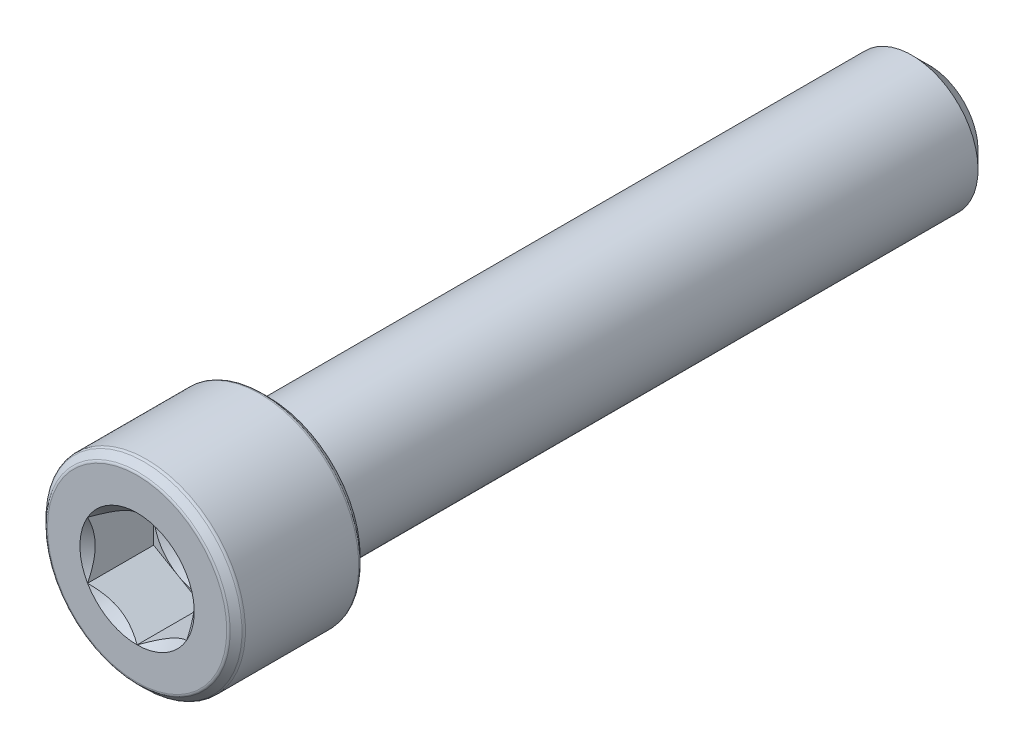
ISO-10303-21;
HEADER;
FILE_DESCRIPTION(('STEP AP214'),'2;1');
FILE_NAME('part.step','',(''),(''),'','','');
FILE_SCHEMA(('AUTOMOTIVE_DESIGN { 1 0 10303 214 1 1 1 1 }'));
ENDSEC;
DATA;
#1=APPLICATION_CONTEXT('core data for automotive mechanical design processes');
#2=APPLICATION_PROTOCOL_DEFINITION('international standard','automotive_design',2000,#1);
#3=PRODUCT_CONTEXT('',#1,'mechanical');
#4=PRODUCT('Part','Part','',(#3));
#5=PRODUCT_RELATED_PRODUCT_CATEGORY('part','',(#4));
#6=PRODUCT_DEFINITION_FORMATION('','',#4);
#7=PRODUCT_DEFINITION_CONTEXT('part definition',#1,'design');
#8=PRODUCT_DEFINITION('design','',#6,#7);
#9=PRODUCT_DEFINITION_SHAPE('','',#8);
#10=(LENGTH_UNIT() NAMED_UNIT(*) SI_UNIT(.MILLI.,.METRE.));
#11=(NAMED_UNIT(*) PLANE_ANGLE_UNIT() SI_UNIT($,.RADIAN.));
#12=(NAMED_UNIT(*) SI_UNIT($,.STERADIAN.) SOLID_ANGLE_UNIT());
#13=UNCERTAINTY_MEASURE_WITH_UNIT(LENGTH_MEASURE(1.E-05),#10,'distance_accuracy_value','');
#14=(GEOMETRIC_REPRESENTATION_CONTEXT(3) GLOBAL_UNCERTAINTY_ASSIGNED_CONTEXT((#13)) GLOBAL_UNIT_ASSIGNED_CONTEXT((#10,
#11,#12)) REPRESENTATION_CONTEXT('',''));
#15=CARTESIAN_POINT('',(0.,0.,0.));
#16=DIRECTION('',(0.,0.,1.));
#17=DIRECTION('',(1.,0.,0.));
#18=AXIS2_PLACEMENT_3D('',#15,#16,#17);
#19=CARTESIAN_POINT('',(0.,2.38125,15.875));
#20=DIRECTION('',(0.,0.,-1.));
#21=DIRECTION('',(0.,1.,0.));
#22=AXIS2_PLACEMENT_3D('',#19,#20,#21);
#23=PLANE('',#22);
#24=DIRECTION('',(-0.866025403784439,0.5,0.));
#25=VECTOR('',#24,1.);
#26=CARTESIAN_POINT('',(2.38125,1.3748153285078,15.875));
#27=LINE('',#26,#25);
#28=CARTESIAN_POINT('',(2.38125,1.3748153285078,15.875));
#29=VERTEX_POINT('',#28);
#30=CARTESIAN_POINT('',(1.190625,2.06222299276169,15.875));
#31=VERTEX_POINT('',#30);
#32=EDGE_CURVE('E276',#29,#31,#27,.T.);
#33=ORIENTED_EDGE('',*,*,#32,.T.);
#34=CARTESIAN_POINT('',(0.,0.,15.875));
#35=DIRECTION('',(0.,0.,1.));
#36=DIRECTION('',(1.,0.,0.));
#37=AXIS2_PLACEMENT_3D('',#34,#35,#36);
#38=CIRCLE('',#37,2.38125);
#39=CARTESIAN_POINT('',(2.38125,0.,15.875));
#40=VERTEX_POINT('',#39);
#41=EDGE_CURVE('E50',#40,#31,#38,.T.);
#42=ORIENTED_EDGE('',*,*,#41,.F.);
#43=DIRECTION('',(0.,1.,0.));
#44=VECTOR('',#43,1.);
#45=CARTESIAN_POINT('',(2.38125,-1.37481532850779,15.875));
#46=LINE('',#45,#44);
#47=EDGE_CURVE('E57',#40,#29,#46,.T.);
#48=ORIENTED_EDGE('',*,*,#47,.T.);
#49=EDGE_LOOP('',(#33,#42,#48));
#50=FACE_BOUND('',#49,.T.);
#51=ADVANCED_FACE('F34',(#50),#23,.F.);
#52=CARTESIAN_POINT('',(2.38125,-1.37481532850779,15.875));
#53=VERTEX_POINT('',#52);
#54=EDGE_CURVE('E181',#53,#40,#46,.T.);
#55=ORIENTED_EDGE('',*,*,#54,.T.);
#56=CARTESIAN_POINT('',(0.,0.,15.875));
#57=DIRECTION('',(0.,0.,-1.));
#58=DIRECTION('',(0.,1.,0.));
#59=AXIS2_PLACEMENT_3D('',#56,#57,#58);
#60=CIRCLE('',#59,2.38125);
#61=CARTESIAN_POINT('',(1.190625,-2.06222299276169,15.875));
#62=VERTEX_POINT('',#61);
#63=EDGE_CURVE('E11',#40,#62,#60,.T.);
#64=ORIENTED_EDGE('',*,*,#63,.T.);
#65=DIRECTION('',(0.866025403784439,0.5,0.));
#66=VECTOR('',#65,1.);
#67=CARTESIAN_POINT('',(0.,-2.74963065701559,15.875));
#68=LINE('',#67,#66);
#69=EDGE_CURVE('E177',#62,#53,#68,.T.);
#70=ORIENTED_EDGE('',*,*,#69,.T.);
#71=EDGE_LOOP('',(#55,#64,#70));
#72=FACE_BOUND('',#71,.T.);
#73=ADVANCED_FACE('F120',(#72),#23,.F.);
#74=CARTESIAN_POINT('',(0.,-2.74963065701559,15.875));
#75=VERTEX_POINT('',#74);
#76=EDGE_CURVE('E178',#75,#62,#68,.T.);
#77=ORIENTED_EDGE('',*,*,#76,.T.);
#78=CARTESIAN_POINT('',(-1.190625,-2.06222299276169,15.875));
#79=VERTEX_POINT('',#78);
#80=EDGE_CURVE('E43',#62,#79,#60,.T.);
#81=ORIENTED_EDGE('',*,*,#80,.T.);
#82=DIRECTION('',(0.866025403784439,-0.5,0.));
#83=VECTOR('',#82,1.);
#84=CARTESIAN_POINT('',(-2.38125,-1.37481532850779,15.875));
#85=LINE('',#84,#83);
#86=EDGE_CURVE('E167',#79,#75,#85,.T.);
#87=ORIENTED_EDGE('',*,*,#86,.T.);
#88=EDGE_LOOP('',(#77,#81,#87));
#89=FACE_BOUND('',#88,.T.);
#90=ADVANCED_FACE('F126',(#89),#23,.F.);
#91=CARTESIAN_POINT('',(-2.38125,-1.37481532850779,15.875));
#92=VERTEX_POINT('',#91);
#93=EDGE_CURVE('E170',#92,#79,#85,.T.);
#94=ORIENTED_EDGE('',*,*,#93,.T.);
#95=CARTESIAN_POINT('',(-2.38125,0.,15.875));
#96=VERTEX_POINT('',#95);
#97=EDGE_CURVE('E235',#79,#96,#60,.T.);
#98=ORIENTED_EDGE('',*,*,#97,.T.);
#99=DIRECTION('',(0.,-1.,0.));
#100=VECTOR('',#99,1.);
#101=CARTESIAN_POINT('',(-2.38125,1.3748153285078,15.875));
#102=LINE('',#101,#100);
#103=EDGE_CURVE('E168',#96,#92,#102,.T.);
#104=ORIENTED_EDGE('',*,*,#103,.T.);
#105=EDGE_LOOP('',(#94,#98,#104));
#106=FACE_BOUND('',#105,.T.);
#107=ADVANCED_FACE('F147',(#106),#23,.F.);
#108=CARTESIAN_POINT('',(-2.38125,1.3748153285078,15.875));
#109=VERTEX_POINT('',#108);
#110=EDGE_CURVE('E159',#109,#96,#102,.T.);
#111=ORIENTED_EDGE('',*,*,#110,.T.);
#112=CARTESIAN_POINT('',(-1.190625,2.0622229927617,15.875));
#113=VERTEX_POINT('',#112);
#114=EDGE_CURVE('E160',#96,#113,#60,.T.);
#115=ORIENTED_EDGE('',*,*,#114,.T.);
#116=DIRECTION('',(-0.866025403784439,-0.5,0.));
#117=VECTOR('',#116,1.);
#118=CARTESIAN_POINT('',(0.,2.74963065701559,15.875));
#119=LINE('',#118,#117);
#120=EDGE_CURVE('E162',#113,#109,#119,.T.);
#121=ORIENTED_EDGE('',*,*,#120,.T.);
#122=EDGE_LOOP('',(#111,#115,#121));
#123=FACE_BOUND('',#122,.T.);
#124=ADVANCED_FACE('F134',(#123),#23,.F.);
#125=CARTESIAN_POINT('',(0.,4.31245577682193,19.05));
#126=DIRECTION('',(0.,0.,-1.));
#127=DIRECTION('',(0.,1.,0.));
#128=AXIS2_PLACEMENT_3D('',#125,#126,#127);
#129=PLANE('',#128);
#130=CARTESIAN_POINT('',(0.,0.,19.05));
#131=DIRECTION('',(0.,0.,1.));
#132=DIRECTION('',(1.,0.,0.));
#133=AXIS2_PLACEMENT_3D('',#130,#131,#132);
#134=CIRCLE('',#133,2.74963065701559);
#135=CARTESIAN_POINT('',(0.,2.74963065701559,19.05));
#136=VERTEX_POINT('',#135);
#137=CARTESIAN_POINT('',(-2.38125,1.3748153285078,19.05));
#138=VERTEX_POINT('',#137);
#139=EDGE_CURVE('E255',#136,#138,#134,.T.);
#140=ORIENTED_EDGE('',*,*,#139,.F.);
#141=CARTESIAN_POINT('',(0.,0.,19.05));
#142=DIRECTION('',(0.,0.,1.));
#143=DIRECTION('',(1.,0.,0.));
#144=AXIS2_PLACEMENT_3D('',#141,#142,#143);
#145=CIRCLE('',#144,2.74963065701559);
#146=CARTESIAN_POINT('',(2.38125,1.37481532850779,19.05));
#147=VERTEX_POINT('',#146);
#148=EDGE_CURVE('E337',#147,#136,#145,.T.);
#149=ORIENTED_EDGE('',*,*,#148,.F.);
#150=CARTESIAN_POINT('',(0.,0.,19.05));
#151=DIRECTION('',(0.,0.,1.));
#152=DIRECTION('',(1.,0.,0.));
#153=AXIS2_PLACEMENT_3D('',#150,#151,#152);
#154=CIRCLE('',#153,2.74963065701559);
#155=CARTESIAN_POINT('',(2.38125,-1.37481532850779,19.05));
#156=VERTEX_POINT('',#155);
#157=EDGE_CURVE('E278',#156,#147,#154,.T.);
#158=ORIENTED_EDGE('',*,*,#157,.F.);
#159=CARTESIAN_POINT('',(0.,0.,19.05));
#160=DIRECTION('',(0.,0.,1.));
#161=DIRECTION('',(1.,0.,0.));
#162=AXIS2_PLACEMENT_3D('',#159,#160,#161);
#163=CIRCLE('',#162,2.74963065701559);
#164=CARTESIAN_POINT('',(0.,-2.74963065701559,19.05));
#165=VERTEX_POINT('',#164);
#166=EDGE_CURVE('E313',#165,#156,#163,.T.);
#167=ORIENTED_EDGE('',*,*,#166,.F.);
#168=CARTESIAN_POINT('',(0.,0.,19.05));
#169=DIRECTION('',(0.,0.,1.));
#170=DIRECTION('',(1.,0.,0.));
#171=AXIS2_PLACEMENT_3D('',#168,#169,#170);
#172=CIRCLE('',#171,2.74963065701559);
#173=CARTESIAN_POINT('',(-2.38125,-1.37481532850779,19.05));
#174=VERTEX_POINT('',#173);
#175=EDGE_CURVE('E254',#174,#165,#172,.T.);
#176=ORIENTED_EDGE('',*,*,#175,.F.);
#177=CARTESIAN_POINT('',(0.,0.,19.05));
#178=DIRECTION('',(0.,0.,1.));
#179=DIRECTION('',(1.,0.,0.));
#180=AXIS2_PLACEMENT_3D('',#177,#178,#179);
#181=CIRCLE('',#180,2.74963065701559);
#182=EDGE_CURVE('E329',#138,#174,#181,.T.);
#183=ORIENTED_EDGE('',*,*,#182,.F.);
#184=EDGE_LOOP('',(#140,#149,#158,#167,#176,#183));
#185=FACE_BOUND('',#184,.T.);
#186=CARTESIAN_POINT('',(0.,0.,19.05));
#187=DIRECTION('',(0.,0.,1.));
#188=DIRECTION('',(0.,-1.,0.));
#189=AXIS2_PLACEMENT_3D('',#186,#187,#188);
#190=CIRCLE('',#189,4.31245577682193);
#191=CARTESIAN_POINT('',(0.,-4.31245577682193,19.05));
#192=VERTEX_POINT('',#191);
#193=EDGE_CURVE('E230',#192,#192,#190,.T.);
#194=ORIENTED_EDGE('',*,*,#193,.T.);
#195=EDGE_LOOP('',(#194));
#196=FACE_BOUND('',#195,.T.);
#197=ADVANCED_FACE('F36',(#185,#196),#129,.F.);
#198=CARTESIAN_POINT('',(0.,0.,18.8833125));
#199=DIRECTION('',(0.,0.,1.));
#200=DIRECTION('',(0.,-1.,0.));
#201=AXIS2_PLACEMENT_3D('',#198,#199,#200);
#202=TOROIDAL_SURFACE('',#201,4.31245577682193,0.166687499999998);
#203=ORIENTED_EDGE('',*,*,#193,.F.);
#204=EDGE_LOOP('',(#203));
#205=FACE_BOUND('',#204,.T.);
#206=CARTESIAN_POINT('',(0.,0.,19.001178361589));
#207=DIRECTION('',(0.,0.,1.));
#208=DIRECTION('',(0.,-1.,0.));
#209=AXIS2_PLACEMENT_3D('',#206,#207,#208);
#210=CIRCLE('',#209,4.43032163841096);
#211=CARTESIAN_POINT('',(0.,-4.43032163841096,19.001178361589));
#212=VERTEX_POINT('',#211);
#213=EDGE_CURVE('E228',#212,#212,#210,.T.);
#214=ORIENTED_EDGE('',*,*,#213,.T.);
#215=EDGE_LOOP('',(#214));
#216=FACE_BOUND('',#215,.T.);
#217=ADVANCED_FACE('F153',(#205,#216),#202,.T.);
#218=CARTESIAN_POINT('',(0.,0.,18.717821638411));
#219=DIRECTION('',(0.,0.,-1.));
#220=DIRECTION('',(0.,1.,0.));
#221=AXIS2_PLACEMENT_3D('',#218,#219,#220);
#222=CONICAL_SURFACE('',#221,4.71367836158903,0.785398163397464);
#223=ORIENTED_EDGE('',*,*,#213,.F.);
#224=EDGE_LOOP('',(#223));
#225=FACE_BOUND('',#224,.T.);
#226=CARTESIAN_POINT('',(0.,0.,18.717821638411));
#227=DIRECTION('',(0.,0.,1.));
#228=DIRECTION('',(0.,-1.,0.));
#229=AXIS2_PLACEMENT_3D('',#226,#227,#228);
#230=CIRCLE('',#229,4.71367836158903);
#231=CARTESIAN_POINT('',(0.,-4.71367836158903,18.717821638411));
#232=VERTEX_POINT('',#231);
#233=EDGE_CURVE('E225',#232,#232,#230,.T.);
#234=ORIENTED_EDGE('',*,*,#233,.T.);
#235=EDGE_LOOP('',(#234));
#236=FACE_BOUND('',#235,.T.);
#237=ADVANCED_FACE('F575',(#225,#236),#222,.T.);
#238=CARTESIAN_POINT('',(0.,0.,18.5999557768219));
#239=DIRECTION('',(0.,0.,1.));
#240=DIRECTION('',(0.,-1.,0.));
#241=AXIS2_PLACEMENT_3D('',#238,#239,#240);
#242=TOROIDAL_SURFACE('',#241,4.5958125,0.166687500000001);
#243=ORIENTED_EDGE('',*,*,#233,.F.);
#244=EDGE_LOOP('',(#243));
#245=FACE_BOUND('',#244,.T.);
#246=CARTESIAN_POINT('',(0.,0.,18.5999557768219));
#247=DIRECTION('',(0.,0.,1.));
#248=DIRECTION('',(0.,-1.,0.));
#249=AXIS2_PLACEMENT_3D('',#246,#247,#248);
#250=CIRCLE('',#249,4.7625);
#251=CARTESIAN_POINT('',(0.,-4.7625,18.5999557768219));
#252=VERTEX_POINT('',#251);
#253=EDGE_CURVE('E222',#252,#252,#250,.T.);
#254=ORIENTED_EDGE('',*,*,#253,.T.);
#255=EDGE_LOOP('',(#254));
#256=FACE_BOUND('',#255,.T.);
#257=ADVANCED_FACE('F565',(#245,#256),#242,.T.);
#258=CARTESIAN_POINT('',(0.,0.,19.05));
#259=DIRECTION('',(0.,0.,1.));
#260=DIRECTION('',(0.,-1.,0.));
#261=AXIS2_PLACEMENT_3D('',#258,#259,#260);
#262=CYLINDRICAL_SURFACE('',#261,4.7625);
#263=ORIENTED_EDGE('',*,*,#253,.F.);
#264=EDGE_LOOP('',(#263));
#265=FACE_BOUND('',#264,.T.);
#266=CARTESIAN_POINT('',(0.,0.,13.1500442231781));
#267=DIRECTION('',(0.,0.,1.));
#268=DIRECTION('',(0.,-1.,0.));
#269=AXIS2_PLACEMENT_3D('',#266,#267,#268);
#270=CIRCLE('',#269,4.7625);
#271=CARTESIAN_POINT('',(0.,-4.7625,13.1500442231781));
#272=VERTEX_POINT('',#271);
#273=EDGE_CURVE('E219',#272,#272,#270,.T.);
#274=ORIENTED_EDGE('',*,*,#273,.T.);
#275=EDGE_LOOP('',(#274));
#276=FACE_BOUND('',#275,.T.);
#277=ADVANCED_FACE('F555',(#265,#276),#262,.T.);
#278=CARTESIAN_POINT('',(0.,0.,13.1500442231781));
#279=DIRECTION('',(0.,0.,1.));
#280=DIRECTION('',(0.,-1.,0.));
#281=AXIS2_PLACEMENT_3D('',#278,#279,#280);
#282=TOROIDAL_SURFACE('',#281,4.5958125,0.166687499999999);
#283=ORIENTED_EDGE('',*,*,#273,.F.);
#284=EDGE_LOOP('',(#283));
#285=FACE_BOUND('',#284,.T.);
#286=CARTESIAN_POINT('',(0.,0.,13.032178361589));
#287=DIRECTION('',(0.,0.,1.));
#288=DIRECTION('',(0.,-1.,0.));
#289=AXIS2_PLACEMENT_3D('',#286,#287,#288);
#290=CIRCLE('',#289,4.71367836158903);
#291=CARTESIAN_POINT('',(0.,-4.71367836158903,13.032178361589));
#292=VERTEX_POINT('',#291);
#293=EDGE_CURVE('E216',#292,#292,#290,.T.);
#294=ORIENTED_EDGE('',*,*,#293,.T.);
#295=EDGE_LOOP('',(#294));
#296=FACE_BOUND('',#295,.T.);
#297=ADVANCED_FACE('F545',(#285,#296),#282,.T.);
#298=CARTESIAN_POINT('',(0.,0.,12.748821638411));
#299=DIRECTION('',(0.,0.,1.));
#300=DIRECTION('',(0.,-1.,0.));
#301=AXIS2_PLACEMENT_3D('',#298,#299,#300);
#302=CONICAL_SURFACE('',#301,4.43032163841097,0.785398163397442);
#303=ORIENTED_EDGE('',*,*,#293,.F.);
#304=EDGE_LOOP('',(#303));
#305=FACE_BOUND('',#304,.T.);
#306=CARTESIAN_POINT('',(0.,0.,12.748821638411));
#307=DIRECTION('',(0.,0.,1.));
#308=DIRECTION('',(0.,-1.,0.));
#309=AXIS2_PLACEMENT_3D('',#306,#307,#308);
#310=CIRCLE('',#309,4.43032163841097);
#311=CARTESIAN_POINT('',(0.,-4.43032163841097,12.748821638411));
#312=VERTEX_POINT('',#311);
#313=EDGE_CURVE('E213',#312,#312,#310,.T.);
#314=ORIENTED_EDGE('',*,*,#313,.T.);
#315=EDGE_LOOP('',(#314));
#316=FACE_BOUND('',#315,.T.);
#317=ADVANCED_FACE('F535',(#305,#316),#302,.T.);
#318=CARTESIAN_POINT('',(0.,0.,12.8666875));
#319=DIRECTION('',(0.,0.,1.));
#320=DIRECTION('',(0.,-1.,0.));
#321=AXIS2_PLACEMENT_3D('',#318,#319,#320);
#322=TOROIDAL_SURFACE('',#321,4.31245577682193,0.166687500000001);
#323=ORIENTED_EDGE('',*,*,#313,.F.);
#324=EDGE_LOOP('',(#323));
#325=FACE_BOUND('',#324,.T.);
#326=CARTESIAN_POINT('',(0.,0.,12.7));
#327=DIRECTION('',(0.,0.,1.));
#328=DIRECTION('',(0.,-1.,0.));
#329=AXIS2_PLACEMENT_3D('',#326,#327,#328);
#330=CIRCLE('',#329,4.31245577682193);
#331=CARTESIAN_POINT('',(0.,-4.31245577682193,12.7));
#332=VERTEX_POINT('',#331);
#333=EDGE_CURVE('E210',#332,#332,#330,.T.);
#334=ORIENTED_EDGE('',*,*,#333,.T.);
#335=EDGE_LOOP('',(#334));
#336=FACE_BOUND('',#335,.T.);
#337=ADVANCED_FACE('F525',(#325,#336),#322,.T.);
#338=CARTESIAN_POINT('',(0.,3.175,12.7));
#339=DIRECTION('',(0.,0.,1.));
#340=DIRECTION('',(0.,-1.,0.));
#341=AXIS2_PLACEMENT_3D('',#338,#339,#340);
#342=PLANE('',#341);
#343=ORIENTED_EDGE('',*,*,#333,.F.);
#344=EDGE_LOOP('',(#343));
#345=FACE_BOUND('',#344,.T.);
#346=CARTESIAN_POINT('',(0.,0.,12.7));
#347=DIRECTION('',(0.,0.,1.));
#348=DIRECTION('',(0.,-1.,0.));
#349=AXIS2_PLACEMENT_3D('',#346,#347,#348);
#350=CIRCLE('',#349,3.175);
#351=CARTESIAN_POINT('',(0.,-3.17499999999999,12.7));
#352=VERTEX_POINT('',#351);
#353=EDGE_CURVE('E207',#352,#352,#350,.T.);
#354=ORIENTED_EDGE('',*,*,#353,.T.);
#355=EDGE_LOOP('',(#354));
#356=FACE_BOUND('',#355,.T.);
#357=ADVANCED_FACE('F515',(#345,#356),#342,.F.);
#358=CARTESIAN_POINT('',(0.,0.,19.05));
#359=DIRECTION('',(0.,0.,1.));
#360=DIRECTION('',(0.,-1.,0.));
#361=AXIS2_PLACEMENT_3D('',#358,#359,#360);
#362=CYLINDRICAL_SURFACE('',#361,3.175);
#363=ORIENTED_EDGE('',*,*,#353,.F.);
#364=EDGE_LOOP('',(#363));
#365=FACE_BOUND('',#364,.T.);
#366=CARTESIAN_POINT('',(0.,0.,-18.2251108028953));
#367=DIRECTION('',(0.,0.,1.));
#368=DIRECTION('',(0.,-1.,0.));
#369=AXIS2_PLACEMENT_3D('',#366,#367,#368);
#370=CIRCLE('',#369,3.175);
#371=CARTESIAN_POINT('',(0.,-3.17499999999999,-18.2251108028953));
#372=VERTEX_POINT('',#371);
#373=EDGE_CURVE('E204',#372,#372,#370,.T.);
#374=ORIENTED_EDGE('',*,*,#373,.T.);
#375=EDGE_LOOP('',(#374));
#376=FACE_BOUND('',#375,.T.);
#377=ADVANCED_FACE('F505',(#365,#376),#362,.T.);
#378=CARTESIAN_POINT('',(0.,0.,-19.05));
#379=DIRECTION('',(0.,0.,1.));
#380=DIRECTION('',(0.,-1.,0.));
#381=AXIS2_PLACEMENT_3D('',#378,#379,#380);
#382=CONICAL_SURFACE('',#381,2.35011080289532,0.785398163397448);
#383=ORIENTED_EDGE('',*,*,#373,.F.);
#384=EDGE_LOOP('',(#383));
#385=FACE_BOUND('',#384,.T.);
#386=CARTESIAN_POINT('',(0.,0.,-19.05));
#387=DIRECTION('',(0.,0.,1.));
#388=DIRECTION('',(0.,-1.,0.));
#389=AXIS2_PLACEMENT_3D('',#386,#387,#388);
#390=CIRCLE('',#389,2.35011080289532);
#391=CARTESIAN_POINT('',(0.,-2.35011080289531,-19.05));
#392=VERTEX_POINT('',#391);
#393=EDGE_CURVE('E188',#392,#392,#390,.T.);
#394=ORIENTED_EDGE('',*,*,#393,.T.);
#395=EDGE_LOOP('',(#394));
#396=FACE_BOUND('',#395,.T.);
#397=ADVANCED_FACE('F496',(#385,#396),#382,.T.);
#398=CARTESIAN_POINT('',(0.,0.,-19.05));
#399=DIRECTION('',(0.,0.,1.));
#400=DIRECTION('',(0.,-1.,0.));
#401=AXIS2_PLACEMENT_3D('',#398,#399,#400);
#402=PLANE('',#401);
#403=ORIENTED_EDGE('',*,*,#393,.F.);
#404=EDGE_LOOP('',(#403));
#405=FACE_BOUND('',#404,.T.);
#406=ADVANCED_FACE('F408',(#405),#402,.F.);
#407=CARTESIAN_POINT('',(2.38125,1.3748153285078,15.875));
#408=DIRECTION('',(0.5,0.866025403784439,0.));
#409=DIRECTION('',(-0.866025403784439,0.5,0.));
#410=AXIS2_PLACEMENT_3D('',#407,#408,#409);
#411=PLANE('',#410);
#412=DIRECTION('',(0.,0.,1.));
#413=VECTOR('',#412,1.);
#414=CARTESIAN_POINT('',(2.38125,1.3748153285078,15.875));
#415=LINE('',#414,#413);
#416=EDGE_CURVE('E185',#29,#147,#415,.T.);
#417=ORIENTED_EDGE('',*,*,#416,.T.);
#418=CARTESIAN_POINT('',(-0.000199999999999399,2.74974612706943,19.0501154773272));
#419=CARTESIAN_POINT('',(0.0816567823790505,2.70248609172789,19.0028948967095));
#420=CARTESIAN_POINT('',(0.16488233377176,2.65443579722785,18.9584475752929));
#421=CARTESIAN_POINT('',(0.334588480838039,2.556455907536,18.8770654569856));
#422=CARTESIAN_POINT('',(0.421085217353101,2.50651699342501,18.8401759430951));
#423=CARTESIAN_POINT('',(0.59550177400904,2.40581754748857,18.7769834131659));
#424=CARTESIAN_POINT('',(0.683377171180673,2.35508266327639,18.7505215587295));
#425=CARTESIAN_POINT('',(0.861062594070873,2.25249593653966,18.7097515156161));
#426=CARTESIAN_POINT('',(0.950867191185869,2.20064722822085,18.6954128915306));
#427=CARTESIAN_POINT('',(1.10563960313034,2.11128933452158,18.6824757847701));
#428=CARTESIAN_POINT('',(1.17040744896962,2.07389560129144,18.6805606046532));
#429=CARTESIAN_POINT('',(1.29983727933557,1.99916925388849,18.6837866227677));
#430=CARTESIAN_POINT('',(1.36449921879335,1.96183666573622,18.6889302948571));
#431=CARTESIAN_POINT('',(1.49321254857739,1.88752399013711,18.7059813108716));
#432=CARTESIAN_POINT('',(1.55726317423485,1.85054434417201,18.7178962213493));
#433=CARTESIAN_POINT('',(1.68425683890527,1.77722451768917,18.747835672352));
#434=CARTESIAN_POINT('',(1.74719996243582,1.74088428837517,18.7658597445185));
#435=CARTESIAN_POINT('',(1.90842615073218,1.64780030516185,18.8193688075524));
#436=CARTESIAN_POINT('',(2.00570949128784,1.59163374230437,18.8588874208722));
#437=CARTESIAN_POINT('',(2.14875606262557,1.50904576583588,18.9256003435508));
#438=CARTESIAN_POINT('',(2.19589628894396,1.48182934348129,18.9490402091113));
#439=CARTESIAN_POINT('',(2.28930352636664,1.42790064981105,18.9980566766595));
#440=CARTESIAN_POINT('',(2.33557105249682,1.40118808114505,19.0236319667669));
#441=CARTESIAN_POINT('',(2.38145,1.37469985845396,19.0501154773272));
#442=B_SPLINE_CURVE_WITH_KNOTS('',3,(#418,#419,#420,#421,#422,#423,#424,#425,#426,#427,#428,
#429,#430,#431,#432,#433,#434,#435,#436,#437,#438,#439,#440,#441),.UNSPECIFIED.,.F.,.F.,(4,2,2,
2,2,2,2,2,2,2,2,4),(0.,0.317196610611948,0.636241461041215,0.950218950629218,1.26340583824125,
1.48752413747844,1.71172100167746,1.93616888974081,2.16059957440836,2.51709639744762,
2.69486147369099,2.87251813383154),.UNSPECIFIED.);
#443=EDGE_CURVE('E274',#136,#147,#442,.T.);
#444=ORIENTED_EDGE('',*,*,#443,.F.);
#445=DIRECTION('',(0.,0.,1.));
#446=VECTOR('',#445,1.);
#447=CARTESIAN_POINT('',(0.,2.74963065701559,15.875));
#448=LINE('',#447,#446);
#449=CARTESIAN_POINT('',(0.,2.74963065701559,15.875));
#450=VERTEX_POINT('',#449);
#451=EDGE_CURVE('E184',#450,#136,#448,.T.);
#452=ORIENTED_EDGE('',*,*,#451,.F.);
#453=EDGE_CURVE('E277',#31,#450,#27,.T.);
#454=ORIENTED_EDGE('',*,*,#453,.F.);
#455=ORIENTED_EDGE('',*,*,#32,.F.);
#456=EDGE_LOOP('',(#417,#444,#452,#454,#455));
#457=FACE_BOUND('',#456,.T.);
#458=ADVANCED_FACE('F272',(#457),#411,.F.);
#459=CARTESIAN_POINT('',(2.38125,-1.37481532850779,15.875));
#460=DIRECTION('',(1.,0.,0.));
#461=DIRECTION('',(0.,1.,0.));
#462=AXIS2_PLACEMENT_3D('',#459,#460,#461);
#463=PLANE('',#462);
#464=DIRECTION('',(0.,0.,1.));
#465=VECTOR('',#464,1.);
#466=CARTESIAN_POINT('',(2.38125,-1.37481532850779,15.875));
#467=LINE('',#466,#465);
#468=EDGE_CURVE('E189',#53,#156,#467,.T.);
#469=ORIENTED_EDGE('',*,*,#468,.T.);
#470=CARTESIAN_POINT('',(2.38125,-2.74194290589386,19.9319808945799));
#471=CARTESIAN_POINT('',(2.38125,-2.67517961056039,19.8815846679781));
#472=CARTESIAN_POINT('',(2.38125,-2.60804251112752,19.8316755875907));
#473=CARTESIAN_POINT('',(2.38125,-2.47287325055307,19.7330498309857));
#474=CARTESIAN_POINT('',(2.38125,-2.40484086895312,19.6843334572448));
#475=CARTESIAN_POINT('',(2.38125,-2.26723593505441,19.5879648544534));
#476=CARTESIAN_POINT('',(2.38125,-2.19765553346049,19.5403237954326));
#477=CARTESIAN_POINT('',(2.38125,-2.05731367842203,19.4468199233866));
#478=CARTESIAN_POINT('',(2.38125,-1.98655230892573,19.4009569847287));
#479=CARTESIAN_POINT('',(2.38125,-1.83957751909225,19.3088459007133));
#480=CARTESIAN_POINT('',(2.38125,-1.76328361992075,19.2627255173928));
#481=CARTESIAN_POINT('',(2.38125,-1.60891357704459,19.1735183038905));
#482=CARTESIAN_POINT('',(2.38125,-1.53083712149137,19.1304320099754));
#483=CARTESIAN_POINT('',(2.38125,-1.37291620334514,19.0482265014712));
#484=CARTESIAN_POINT('',(2.38125,-1.29307799938228,19.0090953578519));
#485=CARTESIAN_POINT('',(2.38125,-1.13121425093132,18.9356679503152));
#486=CARTESIAN_POINT('',(2.38125,-1.04918943681795,18.9013700954538));
#487=CARTESIAN_POINT('',(2.38125,-0.88953525675927,18.8413546314156));
#488=CARTESIAN_POINT('',(2.38125,-0.812083865770257,18.815168478432));
#489=CARTESIAN_POINT('',(2.38125,-0.655316366527661,18.7690097514869));
#490=CARTESIAN_POINT('',(2.38125,-0.57600013021683,18.7490376055837));
#491=CARTESIAN_POINT('',(2.38125,-0.417295761573376,18.7166821452488));
#492=CARTESIAN_POINT('',(2.38125,-0.337934576883847,18.7041688083547));
#493=CARTESIAN_POINT('',(2.38125,-0.178363852969584,18.6869738601659));
#494=CARTESIAN_POINT('',(2.38125,-0.0981544619617682,18.6822909026126));
#495=CARTESIAN_POINT('',(2.38125,0.0594188034321276,18.6811044408392));
#496=CARTESIAN_POINT('',(2.38125,0.136780588525991,18.6843110105046));
#497=CARTESIAN_POINT('',(2.38125,0.290840960607337,18.6980870567428));
#498=CARTESIAN_POINT('',(2.38125,0.367539482435408,18.7086572485871));
#499=CARTESIAN_POINT('',(2.38125,0.521017492835387,18.7367628298525));
#500=CARTESIAN_POINT('',(2.38125,0.597774958394048,18.7544167489314));
#501=CARTESIAN_POINT('',(2.38125,0.749609814257009,18.7957513962434));
#502=CARTESIAN_POINT('',(2.38125,0.824687344568026,18.8194316201904));
#503=CARTESIAN_POINT('',(2.38125,1.06107814410025,18.902894862956));
#504=CARTESIAN_POINT('',(2.38125,1.2190478622181,18.9721839270396));
#505=CARTESIAN_POINT('',(2.38125,1.45021000267341,19.0876640838597));
#506=CARTESIAN_POINT('',(2.38125,1.52644290442584,19.1281730572583));
#507=CARTESIAN_POINT('',(2.38125,1.67717618538172,19.2123026892371));
#508=CARTESIAN_POINT('',(2.38125,1.75167687358839,19.2559227870999));
#509=CARTESIAN_POINT('',(2.38125,1.89548152088327,19.343412556489));
#510=CARTESIAN_POINT('',(2.38125,1.96485959608998,19.3871617927418));
#511=CARTESIAN_POINT('',(2.38125,2.10242624411169,19.4765011587306));
#512=CARTESIAN_POINT('',(2.38125,2.17061472626633,19.5220914279041));
#513=CARTESIAN_POINT('',(2.38125,2.30540317317354,19.6144060050932));
#514=CARTESIAN_POINT('',(2.38125,2.37201154222166,19.6611180928962));
#515=CARTESIAN_POINT('',(2.38125,2.50431800054459,19.7557775780183));
#516=CARTESIAN_POINT('',(2.38125,2.57001633510792,19.8037246320963));
#517=CARTESIAN_POINT('',(2.38125,2.63533378855947,19.8521767335425));
#518=B_SPLINE_CURVE_WITH_KNOTS('',3,(#470,#471,#472,#473,#474,#475,#476,#477,#478,#479,#480,
#481,#482,#483,#484,#485,#486,#487,#488,#489,#490,#491,#492,#493,#494,#495,#496,#497,#498,#499,
#500,#501,#502,#503,#504,#505,#506,#507,#508,#509,#510,#511,#512,#513,#514,#515,#516,#517),
.UNSPECIFIED.,.F.,.F.,(4,2,2,2,2,2,2,2,2,2,2,2,2,2,2,2,2,2,2,2,2,2,2,4),(0.,0.250951284009986,
0.501965564827882,0.754924775973588,1.00786608164542,1.27526207798892,1.54270521780083,
1.80931602029339,2.07583885812519,2.32089852590463,2.56597507114535,2.80664400307697,
3.04727155311264,3.2791894097145,3.51112979698761,3.74712477407482,3.98310000940111,
4.49898139184704,4.75794323931353,5.01685853149447,5.2628896001536,5.50893933794671,
5.75299038397141,5.9969743162797),.UNSPECIFIED.);
#519=EDGE_CURVE('E269',#147,#156,#518,.F.);
#520=ORIENTED_EDGE('',*,*,#519,.F.);
#521=ORIENTED_EDGE('',*,*,#416,.F.);
#522=ORIENTED_EDGE('',*,*,#47,.F.);
#523=ORIENTED_EDGE('',*,*,#54,.F.);
#524=EDGE_LOOP('',(#469,#520,#521,#522,#523));
#525=FACE_BOUND('',#524,.T.);
#526=ADVANCED_FACE('F266',(#525),#463,.F.);
#527=CARTESIAN_POINT('',(0.,-2.74963065701559,15.875));
#528=DIRECTION('',(0.5,-0.866025403784439,0.));
#529=DIRECTION('',(0.866025403784439,0.5,0.));
#530=AXIS2_PLACEMENT_3D('',#527,#528,#529);
#531=PLANE('',#530);
#532=DIRECTION('',(0.,0.,1.));
#533=VECTOR('',#532,1.);
#534=CARTESIAN_POINT('',(0.,-2.74963065701559,15.875));
#535=LINE('',#534,#533);
#536=EDGE_CURVE('E192',#75,#165,#535,.T.);
#537=ORIENTED_EDGE('',*,*,#536,.T.);
#538=CARTESIAN_POINT('',(2.38145,-1.37469985845396,19.0501154773272));
#539=CARTESIAN_POINT('',(2.29959321762095,-1.4219598937955,19.0028948967095));
#540=CARTESIAN_POINT('',(2.21636766622824,-1.47001018829553,18.9584475752929));
#541=CARTESIAN_POINT('',(2.04666151916196,-1.56799007798738,18.8770654569856));
#542=CARTESIAN_POINT('',(1.9601647826469,-1.61792899209838,18.8401759430951));
#543=CARTESIAN_POINT('',(1.78574822599096,-1.71862843803481,18.7769834131659));
#544=CARTESIAN_POINT('',(1.69787282881932,-1.769363322247,18.7505215587295));
#545=CARTESIAN_POINT('',(1.52018740592912,-1.87195004898373,18.7097515156161));
#546=CARTESIAN_POINT('',(1.43038280881413,-1.92379875730254,18.6954128915305));
#547=CARTESIAN_POINT('',(1.27561039686966,-2.01315665100181,18.6824757847701));
#548=CARTESIAN_POINT('',(1.21084255103038,-2.05055038423194,18.6805606046532));
#549=CARTESIAN_POINT('',(1.08141272066443,-2.1252767316349,18.6837866227677));
#550=CARTESIAN_POINT('',(1.01675078120665,-2.16260931978717,18.6889302948571));
#551=CARTESIAN_POINT('',(0.888037451422604,-2.23692199538628,18.7059813108716));
#552=CARTESIAN_POINT('',(0.823986825765147,-2.27390164135138,18.7178962213493));
#553=CARTESIAN_POINT('',(0.696993161094728,-2.34722146783422,18.747835672352));
#554=CARTESIAN_POINT('',(0.634050037564177,-2.38356169714822,18.7658597445185));
#555=CARTESIAN_POINT('',(0.47282384926782,-2.47664568036154,18.8193688075524));
#556=CARTESIAN_POINT('',(0.375540508712162,-2.53281224321901,18.8588874208722));
#557=CARTESIAN_POINT('',(0.232493937374432,-2.6154002196875,18.9256003435508));
#558=CARTESIAN_POINT('',(0.185353711056037,-2.64261664204209,18.9490402091113));
#559=CARTESIAN_POINT('',(0.091946473633362,-2.69654533571233,18.9980566766595));
#560=CARTESIAN_POINT('',(0.045678947503178,-2.72325790437833,19.0236319667669));
#561=CARTESIAN_POINT('',(-0.000200000000001262,-2.74974612706943,19.0501154773272));
#562=B_SPLINE_CURVE_WITH_KNOTS('',3,(#538,#539,#540,#541,#542,#543,#544,#545,#546,#547,#548,
#549,#550,#551,#552,#553,#554,#555,#556,#557,#558,#559,#560,#561),.UNSPECIFIED.,.F.,.F.,(4,2,2,
2,2,2,2,2,2,2,2,4),(0.,0.317196610611948,0.636241461041219,0.950218950629221,1.26340583824126,
1.48752413747844,1.71172100167747,1.93616888974082,2.16059957440836,2.51709639744762,
2.69486147369098,2.87251813383154),.UNSPECIFIED.);
#563=EDGE_CURVE('E261',#156,#165,#562,.T.);
#564=ORIENTED_EDGE('',*,*,#563,.F.);
#565=ORIENTED_EDGE('',*,*,#468,.F.);
#566=ORIENTED_EDGE('',*,*,#69,.F.);
#567=ORIENTED_EDGE('',*,*,#76,.F.);
#568=EDGE_LOOP('',(#537,#564,#565,#566,#567));
#569=FACE_BOUND('',#568,.T.);
#570=ADVANCED_FACE('F259',(#569),#531,.F.);
#571=CARTESIAN_POINT('',(-2.38125,-1.37481532850779,15.875));
#572=DIRECTION('',(-0.5,-0.866025403784439,0.));
#573=DIRECTION('',(0.866025403784439,-0.5,0.));
#574=AXIS2_PLACEMENT_3D('',#571,#572,#573);
#575=PLANE('',#574);
#576=DIRECTION('',(0.,0.,1.));
#577=VECTOR('',#576,1.);
#578=CARTESIAN_POINT('',(-2.38125,-1.37481532850779,15.875));
#579=LINE('',#578,#577);
#580=EDGE_CURVE('E195',#92,#174,#579,.T.);
#581=ORIENTED_EDGE('',*,*,#580,.T.);
#582=CARTESIAN_POINT('',(0.00019999999999992,-2.74974612706943,19.0501154773272));
#583=CARTESIAN_POINT('',(-0.0816567823790497,-2.70248609172789,19.0028948967095));
#584=CARTESIAN_POINT('',(-0.164882333771759,-2.65443579722785,18.9584475752929));
#585=CARTESIAN_POINT('',(-0.334588480838038,-2.556455907536,18.8770654569856));
#586=CARTESIAN_POINT('',(-0.421085217353101,-2.506516993425,18.8401759430951));
#587=CARTESIAN_POINT('',(-0.59550177400904,-2.40581754748857,18.7769834131659));
#588=CARTESIAN_POINT('',(-0.683377171180672,-2.35508266327638,18.7505215587295));
#589=CARTESIAN_POINT('',(-0.861062594070871,-2.25249593653965,18.7097515156161));
#590=CARTESIAN_POINT('',(-0.950867191185866,-2.20064722822085,18.6954128915305));
#591=CARTESIAN_POINT('',(-1.10563960313033,-2.11128933452158,18.6824757847701));
#592=CARTESIAN_POINT('',(-1.17040744896961,-2.07389560129144,18.6805606046532));
#593=CARTESIAN_POINT('',(-1.29983727933557,-1.99916925388849,18.6837866227677));
#594=CARTESIAN_POINT('',(-1.36449921879335,-1.96183666573621,18.6889302948571));
#595=CARTESIAN_POINT('',(-1.49321254857739,-1.88752399013711,18.7059813108716));
#596=CARTESIAN_POINT('',(-1.55726317423485,-1.85054434417201,18.7178962213493));
#597=CARTESIAN_POINT('',(-1.68425683890527,-1.77722451768917,18.747835672352));
#598=CARTESIAN_POINT('',(-1.74719996243582,-1.74088428837517,18.7658597445185));
#599=CARTESIAN_POINT('',(-1.90842615073218,-1.64780030516185,18.8193688075524));
#600=CARTESIAN_POINT('',(-2.00570949128784,-1.59163374230437,18.8588874208722));
#601=CARTESIAN_POINT('',(-2.14875606262557,-1.50904576583588,18.9256003435508));
#602=CARTESIAN_POINT('',(-2.19589628894396,-1.48182934348129,18.9490402091113));
#603=CARTESIAN_POINT('',(-2.28930352636664,-1.42790064981105,18.9980566766595));
#604=CARTESIAN_POINT('',(-2.33557105249682,-1.40118808114505,19.0236319667669));
#605=CARTESIAN_POINT('',(-2.38145,-1.37469985845396,19.0501154773272));
#606=B_SPLINE_CURVE_WITH_KNOTS('',3,(#582,#583,#584,#585,#586,#587,#588,#589,#590,#591,#592,
#593,#594,#595,#596,#597,#598,#599,#600,#601,#602,#603,#604,#605),.UNSPECIFIED.,.F.,.F.,(4,2,2,
2,2,2,2,2,2,2,2,4),(0.,0.317196610611947,0.636241461041217,0.950218950629218,1.26340583824125,
1.48752413747843,1.71172100167746,1.93616888974081,2.16059957440835,2.51709639744762,
2.69486147369098,2.87251813383154),.UNSPECIFIED.);
#607=EDGE_CURVE('E250',#165,#174,#606,.T.);
#608=ORIENTED_EDGE('',*,*,#607,.F.);
#609=ORIENTED_EDGE('',*,*,#536,.F.);
#610=ORIENTED_EDGE('',*,*,#86,.F.);
#611=ORIENTED_EDGE('',*,*,#93,.F.);
#612=EDGE_LOOP('',(#581,#608,#609,#610,#611));
#613=FACE_BOUND('',#612,.T.);
#614=ADVANCED_FACE('F244',(#613),#575,.F.);
#615=CARTESIAN_POINT('',(-2.38125,1.3748153285078,15.875));
#616=DIRECTION('',(-1.,0.,0.));
#617=DIRECTION('',(0.,-1.,0.));
#618=AXIS2_PLACEMENT_3D('',#615,#616,#617);
#619=PLANE('',#618);
#620=DIRECTION('',(0.,0.,1.));
#621=VECTOR('',#620,1.);
#622=CARTESIAN_POINT('',(-2.38125,1.3748153285078,15.875));
#623=LINE('',#622,#621);
#624=EDGE_CURVE('E198',#109,#138,#623,.T.);
#625=ORIENTED_EDGE('',*,*,#624,.T.);
#626=CARTESIAN_POINT('',(-2.38125,-2.74194290589386,19.9319808945799));
#627=CARTESIAN_POINT('',(-2.38125,-2.67517961056039,19.8815846679781));
#628=CARTESIAN_POINT('',(-2.38125,-2.60804251112751,19.8316755875907));
#629=CARTESIAN_POINT('',(-2.38125,-2.47287325055306,19.7330498309857));
#630=CARTESIAN_POINT('',(-2.38125,-2.40484086895312,19.6843334572448));
#631=CARTESIAN_POINT('',(-2.38125,-2.2672359350544,19.5879648544534));
#632=CARTESIAN_POINT('',(-2.38125,-2.19765553346049,19.5403237954326));
#633=CARTESIAN_POINT('',(-2.38125,-2.05731367842203,19.4468199233866));
#634=CARTESIAN_POINT('',(-2.38125,-1.98655230892573,19.4009569847287));
#635=CARTESIAN_POINT('',(-2.38125,-1.83957751909225,19.3088459007133));
#636=CARTESIAN_POINT('',(-2.38125,-1.76328361992075,19.2627255173928));
#637=CARTESIAN_POINT('',(-2.38125,-1.60891357704459,19.1735183038905));
#638=CARTESIAN_POINT('',(-2.38125,-1.53083712149136,19.1304320099754));
#639=CARTESIAN_POINT('',(-2.38125,-1.37291620334514,19.0482265014712));
#640=CARTESIAN_POINT('',(-2.38125,-1.29307799938228,19.0090953578519));
#641=CARTESIAN_POINT('',(-2.38125,-1.13121425093132,18.9356679503152));
#642=CARTESIAN_POINT('',(-2.38125,-1.04918943681795,18.9013700954538));
#643=CARTESIAN_POINT('',(-2.38125,-0.88953525675927,18.8413546314156));
#644=CARTESIAN_POINT('',(-2.38125,-0.812083865770256,18.815168478432));
#645=CARTESIAN_POINT('',(-2.38125,-0.65531636652766,18.7690097514869));
#646=CARTESIAN_POINT('',(-2.38125,-0.576000130216829,18.7490376055837));
#647=CARTESIAN_POINT('',(-2.38125,-0.417295761573374,18.7166821452488));
#648=CARTESIAN_POINT('',(-2.38125,-0.337934576883846,18.7041688083547));
#649=CARTESIAN_POINT('',(-2.38125,-0.178363852969582,18.6869738601659));
#650=CARTESIAN_POINT('',(-2.38125,-0.0981544619617657,18.6822909026126));
#651=CARTESIAN_POINT('',(-2.38125,0.0594188034321301,18.6811044408392));
#652=CARTESIAN_POINT('',(-2.38125,0.136780588525994,18.6843110105046));
#653=CARTESIAN_POINT('',(-2.38125,0.290840960607339,18.6980870567428));
#654=CARTESIAN_POINT('',(-2.38125,0.367539482435409,18.7086572485871));
#655=CARTESIAN_POINT('',(-2.38125,0.521017492835389,18.7367628298525));
#656=CARTESIAN_POINT('',(-2.38125,0.59777495839405,18.7544167489314));
#657=CARTESIAN_POINT('',(-2.38125,0.749609814257011,18.7957513962434));
#658=CARTESIAN_POINT('',(-2.38125,0.824687344568028,18.8194316201904));
#659=CARTESIAN_POINT('',(-2.38125,1.06107814410025,18.902894862956));
#660=CARTESIAN_POINT('',(-2.38125,1.2190478622181,18.9721839270396));
#661=CARTESIAN_POINT('',(-2.38125,1.45021000267341,19.0876640838597));
#662=CARTESIAN_POINT('',(-2.38125,1.52644290442584,19.1281730572583));
#663=CARTESIAN_POINT('',(-2.38125,1.67717618538172,19.2123026892371));
#664=CARTESIAN_POINT('',(-2.38125,1.7516768735884,19.2559227870999));
#665=CARTESIAN_POINT('',(-2.38125,1.89548152088328,19.343412556489));
#666=CARTESIAN_POINT('',(-2.38125,1.96485959608998,19.3871617927418));
#667=CARTESIAN_POINT('',(-2.38125,2.10242624411169,19.4765011587306));
#668=CARTESIAN_POINT('',(-2.38125,2.17061472626633,19.5220914279041));
#669=CARTESIAN_POINT('',(-2.38125,2.30540317317354,19.6144060050932));
#670=CARTESIAN_POINT('',(-2.38125,2.37201154222166,19.6611180928962));
#671=CARTESIAN_POINT('',(-2.38125,2.50431800054459,19.7557775780183));
#672=CARTESIAN_POINT('',(-2.38125,2.57001633510792,19.8037246320963));
#673=CARTESIAN_POINT('',(-2.38125,2.63533378855947,19.8521767335425));
#674=B_SPLINE_CURVE_WITH_KNOTS('',3,(#626,#627,#628,#629,#630,#631,#632,#633,#634,#635,#636,
#637,#638,#639,#640,#641,#642,#643,#644,#645,#646,#647,#648,#649,#650,#651,#652,#653,#654,#655,
#656,#657,#658,#659,#660,#661,#662,#663,#664,#665,#666,#667,#668,#669,#670,#671,#672,#673),
.UNSPECIFIED.,.F.,.F.,(4,2,2,2,2,2,2,2,2,2,2,2,2,2,2,2,2,2,2,2,2,2,2,4),(0.,0.250951284009986,
0.501965564827882,0.754924775973588,1.00786608164542,1.27526207798892,1.54270521780082,
1.80931602029339,2.07583885812519,2.32089852590463,2.56597507114535,2.80664400307697,
3.04727155311264,3.2791894097145,3.51112979698761,3.74712477407482,3.98310000940111,
4.49898139184704,4.75794323931353,5.01685853149447,5.2628896001536,5.50893933794671,
5.75299038397141,5.9969743162797),.UNSPECIFIED.);
#675=EDGE_CURVE('E248',#174,#138,#674,.T.);
#676=ORIENTED_EDGE('',*,*,#675,.F.);
#677=ORIENTED_EDGE('',*,*,#580,.F.);
#678=ORIENTED_EDGE('',*,*,#103,.F.);
#679=ORIENTED_EDGE('',*,*,#110,.F.);
#680=EDGE_LOOP('',(#625,#676,#677,#678,#679));
#681=FACE_BOUND('',#680,.T.);
#682=ADVANCED_FACE('F142',(#681),#619,.F.);
#683=CARTESIAN_POINT('',(0.,2.74963065701559,15.875));
#684=DIRECTION('',(-0.5,0.866025403784439,0.));
#685=DIRECTION('',(-0.866025403784439,-0.5,0.));
#686=AXIS2_PLACEMENT_3D('',#683,#684,#685);
#687=PLANE('',#686);
#688=ORIENTED_EDGE('',*,*,#451,.T.);
#689=CARTESIAN_POINT('',(-2.38145,1.37469985845396,19.0501154773272));
#690=CARTESIAN_POINT('',(-2.29959321762095,1.4219598937955,19.0028948967095));
#691=CARTESIAN_POINT('',(-2.21636766622824,1.47001018829554,18.9584475752929));
#692=CARTESIAN_POINT('',(-2.04666151916196,1.56799007798739,18.8770654569856));
#693=CARTESIAN_POINT('',(-1.9601647826469,1.61792899209838,18.8401759430951));
#694=CARTESIAN_POINT('',(-1.78574822599096,1.71862843803482,18.7769834131659));
#695=CARTESIAN_POINT('',(-1.69787282881933,1.769363322247,18.7505215587295));
#696=CARTESIAN_POINT('',(-1.52018740592913,1.87195004898373,18.7097515156161));
#697=CARTESIAN_POINT('',(-1.43038280881413,1.92379875730254,18.6954128915306));
#698=CARTESIAN_POINT('',(-1.27561039686966,2.01315665100181,18.6824757847701));
#699=CARTESIAN_POINT('',(-1.21084255103038,2.05055038423195,18.6805606046532));
#700=CARTESIAN_POINT('',(-1.08141272066443,2.1252767316349,18.6837866227677));
#701=CARTESIAN_POINT('',(-1.01675078120665,2.16260931978717,18.6889302948571));
#702=CARTESIAN_POINT('',(-0.888037451422605,2.23692199538628,18.7059813108716));
#703=CARTESIAN_POINT('',(-0.823986825765148,2.27390164135138,18.7178962213493));
#704=CARTESIAN_POINT('',(-0.696993161094729,2.34722146783422,18.747835672352));
#705=CARTESIAN_POINT('',(-0.634050037564178,2.38356169714822,18.7658597445185));
#706=CARTESIAN_POINT('',(-0.47282384926782,2.47664568036154,18.8193688075524));
#707=CARTESIAN_POINT('',(-0.375540508712163,2.53281224321902,18.8588874208722));
#708=CARTESIAN_POINT('',(-0.232493937374432,2.61540021968751,18.9256003435508));
#709=CARTESIAN_POINT('',(-0.185353711056037,2.64261664204209,18.9490402091113));
#710=CARTESIAN_POINT('',(-0.0919464736333618,2.69654533571233,18.9980566766595));
#711=CARTESIAN_POINT('',(-0.0456789475031779,2.72325790437833,19.0236319667669));
#712=CARTESIAN_POINT('',(0.000200000000001061,2.74974612706943,19.0501154773272));
#713=B_SPLINE_CURVE_WITH_KNOTS('',3,(#689,#690,#691,#692,#693,#694,#695,#696,#697,#698,#699,
#700,#701,#702,#703,#704,#705,#706,#707,#708,#709,#710,#711,#712),.UNSPECIFIED.,.F.,.F.,(4,2,2,
2,2,2,2,2,2,2,2,4),(0.,0.317196610611949,0.636241461041215,0.950218950629218,1.26340583824125,
1.48752413747844,1.71172100167746,1.93616888974081,2.16059957440835,2.51709639744762,
2.69486147369099,2.87251813383154),.UNSPECIFIED.);
#714=EDGE_CURVE('E306',#138,#136,#713,.T.);
#715=ORIENTED_EDGE('',*,*,#714,.F.);
#716=ORIENTED_EDGE('',*,*,#624,.F.);
#717=ORIENTED_EDGE('',*,*,#120,.F.);
#718=EDGE_CURVE('E172',#450,#113,#119,.T.);
#719=ORIENTED_EDGE('',*,*,#718,.F.);
#720=EDGE_LOOP('',(#688,#715,#716,#717,#719));
#721=FACE_BOUND('',#720,.T.);
#722=ADVANCED_FACE('F132',(#721),#687,.F.);
#723=ORIENTED_EDGE('',*,*,#718,.T.);
#724=EDGE_CURVE('E38',#113,#31,#60,.T.);
#725=ORIENTED_EDGE('',*,*,#724,.T.);
#726=ORIENTED_EDGE('',*,*,#453,.T.);
#727=EDGE_LOOP('',(#723,#725,#726));
#728=FACE_BOUND('',#727,.T.);
#729=ADVANCED_FACE('F122',(#728),#23,.F.);
#730=CARTESIAN_POINT('',(0.,0.,19.05));
#731=DIRECTION('',(0.,0.,1.));
#732=DIRECTION('',(1.,0.,0.));
#733=AXIS2_PLACEMENT_3D('',#730,#731,#732);
#734=CONICAL_SURFACE('',#733,2.74963065701559,0.78539816339745);
#735=ORIENTED_EDGE('',*,*,#714,.T.);
#736=ORIENTED_EDGE('',*,*,#139,.T.);
#737=EDGE_LOOP('',(#735,#736));
#738=FACE_BOUND('',#737,.T.);
#739=ADVANCED_FACE('F131',(#738),#734,.F.);
#740=CARTESIAN_POINT('',(0.,0.,19.05));
#741=DIRECTION('',(0.,0.,1.));
#742=DIRECTION('',(1.,0.,0.));
#743=AXIS2_PLACEMENT_3D('',#740,#741,#742);
#744=CONICAL_SURFACE('',#743,2.74963065701559,0.78539816339745);
#745=ORIENTED_EDGE('',*,*,#607,.T.);
#746=ORIENTED_EDGE('',*,*,#175,.T.);
#747=EDGE_LOOP('',(#745,#746));
#748=FACE_BOUND('',#747,.T.);
#749=ADVANCED_FACE('F139',(#748),#744,.F.);
#750=CARTESIAN_POINT('',(0.,0.,19.05));
#751=DIRECTION('',(0.,0.,1.));
#752=DIRECTION('',(1.,0.,0.));
#753=AXIS2_PLACEMENT_3D('',#750,#751,#752);
#754=CONICAL_SURFACE('',#753,2.74963065701559,0.78539816339745);
#755=ORIENTED_EDGE('',*,*,#519,.T.);
#756=ORIENTED_EDGE('',*,*,#157,.T.);
#757=EDGE_LOOP('',(#755,#756));
#758=FACE_BOUND('',#757,.T.);
#759=ADVANCED_FACE('F292',(#758),#754,.F.);
#760=CARTESIAN_POINT('',(0.,0.,19.05));
#761=DIRECTION('',(0.,0.,1.));
#762=DIRECTION('',(1.,0.,0.));
#763=AXIS2_PLACEMENT_3D('',#760,#761,#762);
#764=CONICAL_SURFACE('',#763,2.74963065701559,0.78539816339745);
#765=ORIENTED_EDGE('',*,*,#563,.T.);
#766=ORIENTED_EDGE('',*,*,#166,.T.);
#767=EDGE_LOOP('',(#765,#766));
#768=FACE_BOUND('',#767,.T.);
#769=ADVANCED_FACE('F296',(#768),#764,.F.);
#770=CARTESIAN_POINT('',(0.,0.,19.05));
#771=DIRECTION('',(0.,0.,1.));
#772=DIRECTION('',(1.,0.,0.));
#773=AXIS2_PLACEMENT_3D('',#770,#771,#772);
#774=CONICAL_SURFACE('',#773,2.74963065701559,0.78539816339745);
#775=ORIENTED_EDGE('',*,*,#675,.T.);
#776=ORIENTED_EDGE('',*,*,#182,.T.);
#777=EDGE_LOOP('',(#775,#776));
#778=FACE_BOUND('',#777,.T.);
#779=ADVANCED_FACE('F115',(#778),#774,.F.);
#780=CARTESIAN_POINT('',(0.,0.,19.05));
#781=DIRECTION('',(0.,0.,1.));
#782=DIRECTION('',(1.,0.,0.));
#783=AXIS2_PLACEMENT_3D('',#780,#781,#782);
#784=CONICAL_SURFACE('',#783,2.74963065701559,0.78539816339745);
#785=ORIENTED_EDGE('',*,*,#443,.T.);
#786=ORIENTED_EDGE('',*,*,#148,.T.);
#787=EDGE_LOOP('',(#785,#786));
#788=FACE_BOUND('',#787,.T.);
#789=ADVANCED_FACE('F110',(#788),#784,.F.);
#790=CARTESIAN_POINT('',(0.,0.,15.875));
#791=DIRECTION('',(0.,0.,1.));
#792=DIRECTION('',(1.,0.,0.));
#793=AXIS2_PLACEMENT_3D('',#790,#791,#792);
#794=CONICAL_SURFACE('',#793,2.38125,1.0471975511966);
#795=CARTESIAN_POINT('',(0.,0.,14.5001846714922));
#796=VERTEX_POINT('',#795);
#797=VERTEX_LOOP('',#796);
#798=FACE_BOUND('',#797,.T.);
#799=ORIENTED_EDGE('',*,*,#41,.T.);
#800=ORIENTED_EDGE('',*,*,#724,.F.);
#801=ORIENTED_EDGE('',*,*,#114,.F.);
#802=ORIENTED_EDGE('',*,*,#97,.F.);
#803=ORIENTED_EDGE('',*,*,#80,.F.);
#804=ORIENTED_EDGE('',*,*,#63,.F.);
#805=EDGE_LOOP('',(#799,#800,#801,#802,#803,#804));
#806=FACE_BOUND('',#805,.T.);
#807=ADVANCED_FACE('F108',(#798,#806),#794,.F.);
#808=CLOSED_SHELL('',(#51,#73,#90,#107,#124,#197,#217,#237,#257,#277,#297,#317,#337,#357,#377,
#397,#406,#458,#526,#570,#614,#682,#722,#729,#739,#749,#759,#769,#779,#789,#807));
#809=MANIFOLD_SOLID_BREP('B2',#808);
#810=ADVANCED_BREP_SHAPE_REPRESENTATION('',(#18,#809),#14);
#811=SHAPE_DEFINITION_REPRESENTATION(#9,#810);
ENDSEC;
END-ISO-10303-21;
